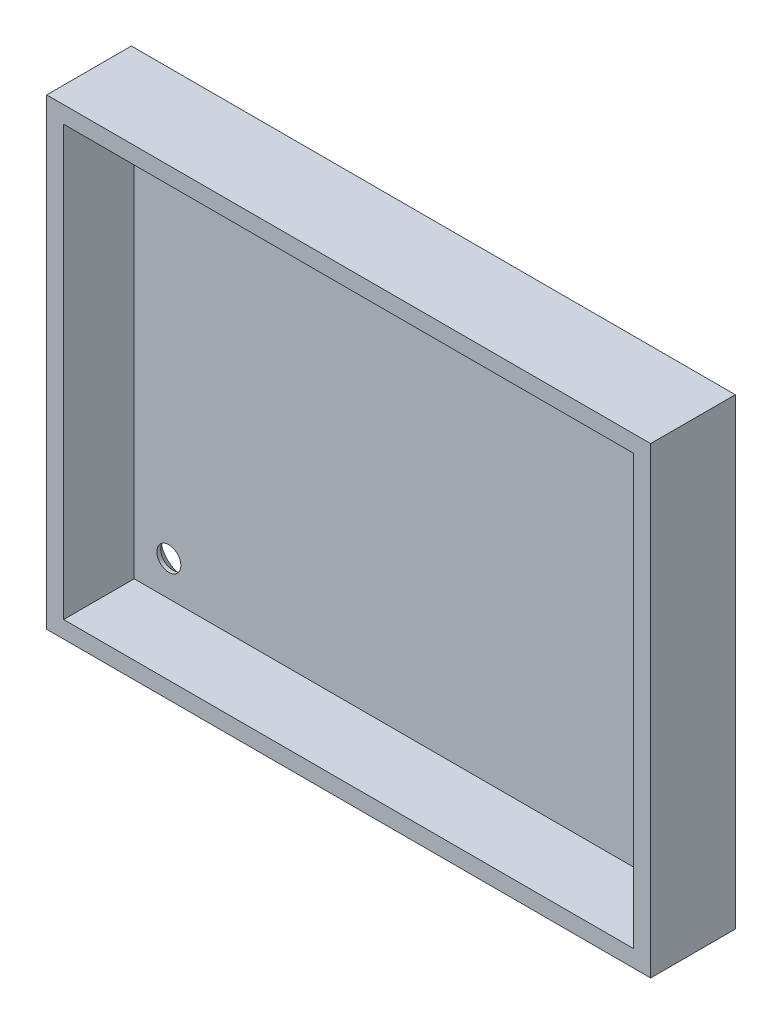
ISO-10303-21;
HEADER;
FILE_DESCRIPTION(('STEP AP214'),'2;1');
FILE_NAME('part.step','',(''),(''),'','','');
FILE_SCHEMA(('AUTOMOTIVE_DESIGN { 1 0 10303 214 1 1 1 1 }'));
ENDSEC;
DATA;
#1=APPLICATION_CONTEXT('core data for automotive mechanical design processes');
#2=APPLICATION_PROTOCOL_DEFINITION('international standard','automotive_design',2000,#1);
#3=PRODUCT_CONTEXT('',#1,'mechanical');
#4=PRODUCT('Part','Part','',(#3));
#5=PRODUCT_RELATED_PRODUCT_CATEGORY('part','',(#4));
#6=PRODUCT_DEFINITION_FORMATION('','',#4);
#7=PRODUCT_DEFINITION_CONTEXT('part definition',#1,'design');
#8=PRODUCT_DEFINITION('design','',#6,#7);
#9=PRODUCT_DEFINITION_SHAPE('','',#8);
#10=(LENGTH_UNIT() NAMED_UNIT(*) SI_UNIT(.MILLI.,.METRE.));
#11=(NAMED_UNIT(*) PLANE_ANGLE_UNIT() SI_UNIT($,.RADIAN.));
#12=(NAMED_UNIT(*) SI_UNIT($,.STERADIAN.) SOLID_ANGLE_UNIT());
#13=UNCERTAINTY_MEASURE_WITH_UNIT(LENGTH_MEASURE(1.E-05),#10,'distance_accuracy_value','');
#14=(GEOMETRIC_REPRESENTATION_CONTEXT(3) GLOBAL_UNCERTAINTY_ASSIGNED_CONTEXT((#13)) GLOBAL_UNIT_ASSIGNED_CONTEXT((#10,
#11,#12)) REPRESENTATION_CONTEXT('',''));
#15=CARTESIAN_POINT('',(0.,0.,0.));
#16=DIRECTION('',(0.,0.,1.));
#17=DIRECTION('',(1.,0.,0.));
#18=AXIS2_PLACEMENT_3D('',#15,#16,#17);
#19=CARTESIAN_POINT('',(0.,0.,-2.));
#20=DIRECTION('',(0.,0.,1.));
#21=DIRECTION('',(1.,0.,0.));
#22=AXIS2_PLACEMENT_3D('',#19,#20,#21);
#23=PLANE('',#22);
#24=DIRECTION('',(0.,1.,0.));
#25=VECTOR('',#24,1.);
#26=CARTESIAN_POINT('',(42.8,30.4,-2.));
#27=LINE('',#26,#25);
#28=CARTESIAN_POINT('',(42.8,-32.8,-2.));
#29=VERTEX_POINT('',#28);
#30=CARTESIAN_POINT('',(42.8,32.8,-2.));
#31=VERTEX_POINT('',#30);
#32=EDGE_CURVE('E120',#29,#31,#27,.T.);
#33=ORIENTED_EDGE('',*,*,#32,.F.);
#34=DIRECTION('',(1.,0.,0.));
#35=VECTOR('',#34,1.);
#36=CARTESIAN_POINT('',(-40.4,-32.8,-2.));
#37=LINE('',#36,#35);
#38=CARTESIAN_POINT('',(-42.8,-32.8,-2.));
#39=VERTEX_POINT('',#38);
#40=EDGE_CURVE('E154',#39,#29,#37,.T.);
#41=ORIENTED_EDGE('',*,*,#40,.F.);
#42=DIRECTION('',(0.,-1.,0.));
#43=VECTOR('',#42,1.);
#44=CARTESIAN_POINT('',(-42.8,30.4,-2.));
#45=LINE('',#44,#43);
#46=CARTESIAN_POINT('',(-42.8,32.8,-2.));
#47=VERTEX_POINT('',#46);
#48=EDGE_CURVE('E150',#47,#39,#45,.T.);
#49=ORIENTED_EDGE('',*,*,#48,.F.);
#50=DIRECTION('',(-1.,0.,0.));
#51=VECTOR('',#50,1.);
#52=CARTESIAN_POINT('',(-40.4,32.8,-2.));
#53=LINE('',#52,#51);
#54=EDGE_CURVE('E143',#31,#47,#53,.T.);
#55=ORIENTED_EDGE('',*,*,#54,.F.);
#56=EDGE_LOOP('',(#33,#41,#49,#55));
#57=FACE_BOUND('',#56,.T.);
#58=CARTESIAN_POINT('',(-35.4882310319587,25.4606514026197,-2.));
#59=DIRECTION('',(0.,0.,-1.));
#60=DIRECTION('',(-1.,0.,0.));
#61=AXIS2_PLACEMENT_3D('',#58,#59,#60);
#62=CIRCLE('',#61,3.15);
#63=CARTESIAN_POINT('',(-38.6382310319587,25.4606514026197,-2.));
#64=VERTEX_POINT('',#63);
#65=EDGE_CURVE('E184',#64,#64,#62,.T.);
#66=ORIENTED_EDGE('',*,*,#65,.F.);
#67=EDGE_LOOP('',(#66));
#68=FACE_BOUND('',#67,.T.);
#69=CARTESIAN_POINT('',(35.4882310319587,25.3987624345948,-2.));
#70=DIRECTION('',(0.,0.,-1.));
#71=DIRECTION('',(-1.,0.,0.));
#72=AXIS2_PLACEMENT_3D('',#69,#70,#71);
#73=CIRCLE('',#72,3.15);
#74=CARTESIAN_POINT('',(32.3382310319587,25.3987624345948,-2.));
#75=VERTEX_POINT('',#74);
#76=EDGE_CURVE('E188',#75,#75,#73,.T.);
#77=ORIENTED_EDGE('',*,*,#76,.F.);
#78=EDGE_LOOP('',(#77));
#79=FACE_BOUND('',#78,.T.);
#80=CARTESIAN_POINT('',(35.4882310319587,-25.4606514026197,-2.));
#81=DIRECTION('',(0.,0.,-1.));
#82=DIRECTION('',(-1.,0.,0.));
#83=AXIS2_PLACEMENT_3D('',#80,#81,#82);
#84=CIRCLE('',#83,3.15);
#85=CARTESIAN_POINT('',(32.3382310319587,-25.4606514026197,-2.));
#86=VERTEX_POINT('',#85);
#87=EDGE_CURVE('E192',#86,#86,#84,.T.);
#88=ORIENTED_EDGE('',*,*,#87,.F.);
#89=EDGE_LOOP('',(#88));
#90=FACE_BOUND('',#89,.T.);
#91=CARTESIAN_POINT('',(-35.4882310319587,-25.4606514026197,-2.));
#92=DIRECTION('',(0.,0.,-1.));
#93=DIRECTION('',(-1.,0.,0.));
#94=AXIS2_PLACEMENT_3D('',#91,#92,#93);
#95=CIRCLE('',#94,3.15);
#96=CARTESIAN_POINT('',(-38.6382310319587,-25.4606514026197,-2.));
#97=VERTEX_POINT('',#96);
#98=EDGE_CURVE('E195',#97,#97,#95,.T.);
#99=ORIENTED_EDGE('',*,*,#98,.F.);
#100=EDGE_LOOP('',(#99));
#101=FACE_BOUND('',#100,.T.);
#102=ADVANCED_FACE('F33',(#57,#68,#79,#90,#101),#23,.F.);
#103=CARTESIAN_POINT('',(42.8,30.4,10.));
#104=DIRECTION('',(-1.,0.,0.));
#105=DIRECTION('',(0.,-1.,0.));
#106=AXIS2_PLACEMENT_3D('',#103,#104,#105);
#107=PLANE('',#106);
#108=ORIENTED_EDGE('',*,*,#32,.T.);
#109=DIRECTION('',(0.,0.,-1.));
#110=VECTOR('',#109,1.);
#111=CARTESIAN_POINT('',(42.8,32.8,10.));
#112=LINE('',#111,#110);
#113=CARTESIAN_POINT('',(42.8,32.8,10.));
#114=VERTEX_POINT('',#113);
#115=EDGE_CURVE('E11',#114,#31,#112,.T.);
#116=ORIENTED_EDGE('',*,*,#115,.F.);
#117=DIRECTION('',(0.,1.,0.));
#118=VECTOR('',#117,1.);
#119=CARTESIAN_POINT('',(42.8,30.4,10.));
#120=LINE('',#119,#118);
#121=CARTESIAN_POINT('',(42.8,-32.8,10.));
#122=VERTEX_POINT('',#121);
#123=EDGE_CURVE('E158',#122,#114,#120,.T.);
#124=ORIENTED_EDGE('',*,*,#123,.F.);
#125=DIRECTION('',(0.,0.,-1.));
#126=VECTOR('',#125,1.);
#127=CARTESIAN_POINT('',(42.8,-32.8,10.));
#128=LINE('',#127,#126);
#129=EDGE_CURVE('E145',#122,#29,#128,.T.);
#130=ORIENTED_EDGE('',*,*,#129,.T.);
#131=EDGE_LOOP('',(#108,#116,#124,#130));
#132=FACE_BOUND('',#131,.T.);
#133=ADVANCED_FACE('F175',(#132),#107,.F.);
#134=CARTESIAN_POINT('',(-40.4,32.8,10.));
#135=DIRECTION('',(0.,-1.,0.));
#136=DIRECTION('',(0.,0.,-1.));
#137=AXIS2_PLACEMENT_3D('',#134,#135,#136);
#138=PLANE('',#137);
#139=ORIENTED_EDGE('',*,*,#54,.T.);
#140=DIRECTION('',(0.,0.,-1.));
#141=VECTOR('',#140,1.);
#142=CARTESIAN_POINT('',(-42.8,32.8,10.));
#143=LINE('',#142,#141);
#144=CARTESIAN_POINT('',(-42.8,32.8,10.));
#145=VERTEX_POINT('',#144);
#146=EDGE_CURVE('E41',#145,#47,#143,.T.);
#147=ORIENTED_EDGE('',*,*,#146,.F.);
#148=DIRECTION('',(-1.,0.,0.));
#149=VECTOR('',#148,1.);
#150=CARTESIAN_POINT('',(-40.4,32.8,10.));
#151=LINE('',#150,#149);
#152=EDGE_CURVE('E160',#114,#145,#151,.T.);
#153=ORIENTED_EDGE('',*,*,#152,.F.);
#154=ORIENTED_EDGE('',*,*,#115,.T.);
#155=EDGE_LOOP('',(#139,#147,#153,#154));
#156=FACE_BOUND('',#155,.T.);
#157=ADVANCED_FACE('F177',(#156),#138,.F.);
#158=CARTESIAN_POINT('',(-42.8,30.4,10.));
#159=DIRECTION('',(1.,0.,0.));
#160=DIRECTION('',(0.,1.,0.));
#161=AXIS2_PLACEMENT_3D('',#158,#159,#160);
#162=PLANE('',#161);
#163=ORIENTED_EDGE('',*,*,#48,.T.);
#164=DIRECTION('',(0.,0.,-1.));
#165=VECTOR('',#164,1.);
#166=CARTESIAN_POINT('',(-42.8,-32.8,10.));
#167=LINE('',#166,#165);
#168=CARTESIAN_POINT('',(-42.8,-32.8,10.));
#169=VERTEX_POINT('',#168);
#170=EDGE_CURVE('E148',#169,#39,#167,.T.);
#171=ORIENTED_EDGE('',*,*,#170,.F.);
#172=DIRECTION('',(0.,-1.,0.));
#173=VECTOR('',#172,1.);
#174=CARTESIAN_POINT('',(-42.8,30.4,10.));
#175=LINE('',#174,#173);
#176=EDGE_CURVE('E161',#145,#169,#175,.T.);
#177=ORIENTED_EDGE('',*,*,#176,.F.);
#178=ORIENTED_EDGE('',*,*,#146,.T.);
#179=EDGE_LOOP('',(#163,#171,#177,#178));
#180=FACE_BOUND('',#179,.T.);
#181=ADVANCED_FACE('F166',(#180),#162,.F.);
#182=CARTESIAN_POINT('',(-40.4,-32.8,10.));
#183=DIRECTION('',(0.,1.,0.));
#184=DIRECTION('',(0.,0.,1.));
#185=AXIS2_PLACEMENT_3D('',#182,#183,#184);
#186=PLANE('',#185);
#187=ORIENTED_EDGE('',*,*,#40,.T.);
#188=ORIENTED_EDGE('',*,*,#129,.F.);
#189=DIRECTION('',(1.,0.,0.));
#190=VECTOR('',#189,1.);
#191=CARTESIAN_POINT('',(-40.4,-32.8,10.));
#192=LINE('',#191,#190);
#193=EDGE_CURVE('E36',#169,#122,#192,.T.);
#194=ORIENTED_EDGE('',*,*,#193,.F.);
#195=ORIENTED_EDGE('',*,*,#170,.T.);
#196=EDGE_LOOP('',(#187,#188,#194,#195));
#197=FACE_BOUND('',#196,.T.);
#198=ADVANCED_FACE('F170',(#197),#186,.F.);
#199=CARTESIAN_POINT('',(0.,0.,10.));
#200=DIRECTION('',(0.,0.,1.));
#201=DIRECTION('',(1.,0.,0.));
#202=AXIS2_PLACEMENT_3D('',#199,#200,#201);
#203=PLANE('',#202);
#204=DIRECTION('',(0.,1.,0.));
#205=VECTOR('',#204,1.);
#206=CARTESIAN_POINT('',(40.4,30.4,10.));
#207=LINE('',#206,#205);
#208=CARTESIAN_POINT('',(40.4,-30.4,10.));
#209=VERTEX_POINT('',#208);
#210=CARTESIAN_POINT('',(40.4,30.4,10.));
#211=VERTEX_POINT('',#210);
#212=EDGE_CURVE('E101',#209,#211,#207,.T.);
#213=ORIENTED_EDGE('',*,*,#212,.F.);
#214=DIRECTION('',(1.,0.,0.));
#215=VECTOR('',#214,1.);
#216=CARTESIAN_POINT('',(-40.4,-30.4,10.));
#217=LINE('',#216,#215);
#218=CARTESIAN_POINT('',(-40.4,-30.4,10.));
#219=VERTEX_POINT('',#218);
#220=EDGE_CURVE('E127',#219,#209,#217,.T.);
#221=ORIENTED_EDGE('',*,*,#220,.F.);
#222=DIRECTION('',(0.,-1.,0.));
#223=VECTOR('',#222,1.);
#224=CARTESIAN_POINT('',(-40.4,30.4,10.));
#225=LINE('',#224,#223);
#226=CARTESIAN_POINT('',(-40.4,30.4,10.));
#227=VERTEX_POINT('',#226);
#228=EDGE_CURVE('E125',#227,#219,#225,.T.);
#229=ORIENTED_EDGE('',*,*,#228,.F.);
#230=DIRECTION('',(-1.,0.,0.));
#231=VECTOR('',#230,1.);
#232=CARTESIAN_POINT('',(-40.4,30.4,10.));
#233=LINE('',#232,#231);
#234=EDGE_CURVE('E112',#211,#227,#233,.T.);
#235=ORIENTED_EDGE('',*,*,#234,.F.);
#236=EDGE_LOOP('',(#213,#221,#229,#235));
#237=FACE_BOUND('',#236,.T.);
#238=ORIENTED_EDGE('',*,*,#123,.T.);
#239=ORIENTED_EDGE('',*,*,#152,.T.);
#240=ORIENTED_EDGE('',*,*,#176,.T.);
#241=ORIENTED_EDGE('',*,*,#193,.T.);
#242=EDGE_LOOP('',(#238,#239,#240,#241));
#243=FACE_BOUND('',#242,.T.);
#244=ADVANCED_FACE('F124',(#237,#243),#203,.T.);
#245=CARTESIAN_POINT('',(40.4,30.4,10.));
#246=DIRECTION('',(-1.,0.,0.));
#247=DIRECTION('',(0.,-1.,0.));
#248=AXIS2_PLACEMENT_3D('',#245,#246,#247);
#249=PLANE('',#248);
#250=DIRECTION('',(0.,1.,0.));
#251=VECTOR('',#250,1.);
#252=CARTESIAN_POINT('',(40.4,30.4,0.));
#253=LINE('',#252,#251);
#254=CARTESIAN_POINT('',(40.4,-30.4,0.));
#255=VERTEX_POINT('',#254);
#256=CARTESIAN_POINT('',(40.4,30.4,0.));
#257=VERTEX_POINT('',#256);
#258=EDGE_CURVE('E132',#255,#257,#253,.T.);
#259=ORIENTED_EDGE('',*,*,#258,.F.);
#260=DIRECTION('',(0.,0.,-1.));
#261=VECTOR('',#260,1.);
#262=CARTESIAN_POINT('',(40.4,-30.4,10.));
#263=LINE('',#262,#261);
#264=EDGE_CURVE('E108',#209,#255,#263,.T.);
#265=ORIENTED_EDGE('',*,*,#264,.F.);
#266=ORIENTED_EDGE('',*,*,#212,.T.);
#267=DIRECTION('',(0.,0.,-1.));
#268=VECTOR('',#267,1.);
#269=CARTESIAN_POINT('',(40.4,30.4,10.));
#270=LINE('',#269,#268);
#271=EDGE_CURVE('E105',#211,#257,#270,.T.);
#272=ORIENTED_EDGE('',*,*,#271,.T.);
#273=EDGE_LOOP('',(#259,#265,#266,#272));
#274=FACE_BOUND('',#273,.T.);
#275=ADVANCED_FACE('F104',(#274),#249,.T.);
#276=CARTESIAN_POINT('',(-40.4,30.4,10.));
#277=DIRECTION('',(0.,-1.,0.));
#278=DIRECTION('',(0.,0.,-1.));
#279=AXIS2_PLACEMENT_3D('',#276,#277,#278);
#280=PLANE('',#279);
#281=DIRECTION('',(-1.,0.,0.));
#282=VECTOR('',#281,1.);
#283=CARTESIAN_POINT('',(-40.4,30.4,0.));
#284=LINE('',#283,#282);
#285=CARTESIAN_POINT('',(-40.4,30.4,0.));
#286=VERTEX_POINT('',#285);
#287=EDGE_CURVE('E119',#257,#286,#284,.T.);
#288=ORIENTED_EDGE('',*,*,#287,.F.);
#289=ORIENTED_EDGE('',*,*,#271,.F.);
#290=ORIENTED_EDGE('',*,*,#234,.T.);
#291=DIRECTION('',(0.,0.,-1.));
#292=VECTOR('',#291,1.);
#293=CARTESIAN_POINT('',(-40.4,30.4,10.));
#294=LINE('',#293,#292);
#295=EDGE_CURVE('E121',#227,#286,#294,.T.);
#296=ORIENTED_EDGE('',*,*,#295,.T.);
#297=EDGE_LOOP('',(#288,#289,#290,#296));
#298=FACE_BOUND('',#297,.T.);
#299=ADVANCED_FACE('F116',(#298),#280,.T.);
#300=CARTESIAN_POINT('',(-40.4,30.4,10.));
#301=DIRECTION('',(1.,0.,0.));
#302=DIRECTION('',(0.,1.,0.));
#303=AXIS2_PLACEMENT_3D('',#300,#301,#302);
#304=PLANE('',#303);
#305=DIRECTION('',(0.,-1.,0.));
#306=VECTOR('',#305,1.);
#307=CARTESIAN_POINT('',(-40.4,30.4,0.));
#308=LINE('',#307,#306);
#309=CARTESIAN_POINT('',(-40.4,-30.4,0.));
#310=VERTEX_POINT('',#309);
#311=EDGE_CURVE('E136',#286,#310,#308,.T.);
#312=ORIENTED_EDGE('',*,*,#311,.F.);
#313=ORIENTED_EDGE('',*,*,#295,.F.);
#314=ORIENTED_EDGE('',*,*,#228,.T.);
#315=DIRECTION('',(0.,0.,-1.));
#316=VECTOR('',#315,1.);
#317=CARTESIAN_POINT('',(-40.4,-30.4,10.));
#318=LINE('',#317,#316);
#319=EDGE_CURVE('E49',#219,#310,#318,.T.);
#320=ORIENTED_EDGE('',*,*,#319,.T.);
#321=EDGE_LOOP('',(#312,#313,#314,#320));
#322=FACE_BOUND('',#321,.T.);
#323=ADVANCED_FACE('F235',(#322),#304,.T.);
#324=CARTESIAN_POINT('',(-40.4,-30.4,10.));
#325=DIRECTION('',(0.,1.,0.));
#326=DIRECTION('',(0.,0.,1.));
#327=AXIS2_PLACEMENT_3D('',#324,#325,#326);
#328=PLANE('',#327);
#329=DIRECTION('',(1.,0.,0.));
#330=VECTOR('',#329,1.);
#331=CARTESIAN_POINT('',(-40.4,-30.4,0.));
#332=LINE('',#331,#330);
#333=EDGE_CURVE('E113',#310,#255,#332,.T.);
#334=ORIENTED_EDGE('',*,*,#333,.F.);
#335=ORIENTED_EDGE('',*,*,#319,.F.);
#336=ORIENTED_EDGE('',*,*,#220,.T.);
#337=ORIENTED_EDGE('',*,*,#264,.T.);
#338=EDGE_LOOP('',(#334,#335,#336,#337));
#339=FACE_BOUND('',#338,.T.);
#340=ADVANCED_FACE('F230',(#339),#328,.T.);
#341=CARTESIAN_POINT('',(0.,0.,0.));
#342=DIRECTION('',(0.,0.,1.));
#343=DIRECTION('',(1.,0.,0.));
#344=AXIS2_PLACEMENT_3D('',#341,#342,#343);
#345=PLANE('',#344);
#346=CARTESIAN_POINT('',(-35.4882310319587,-25.4606514026197,0.));
#347=DIRECTION('',(0.,0.,1.));
#348=DIRECTION('',(1.,0.,0.));
#349=AXIS2_PLACEMENT_3D('',#346,#347,#348);
#350=CIRCLE('',#349,1.7);
#351=CARTESIAN_POINT('',(-33.7882310319587,-25.4606514026197,0.));
#352=VERTEX_POINT('',#351);
#353=EDGE_CURVE('E200',#352,#352,#350,.T.);
#354=ORIENTED_EDGE('',*,*,#353,.F.);
#355=EDGE_LOOP('',(#354));
#356=FACE_BOUND('',#355,.T.);
#357=CARTESIAN_POINT('',(35.4882310319587,-25.4606514026197,0.));
#358=DIRECTION('',(0.,0.,1.));
#359=DIRECTION('',(1.,0.,0.));
#360=AXIS2_PLACEMENT_3D('',#357,#358,#359);
#361=CIRCLE('',#360,1.7);
#362=CARTESIAN_POINT('',(37.1882310319587,-25.4606514026197,0.));
#363=VERTEX_POINT('',#362);
#364=EDGE_CURVE('E209',#363,#363,#361,.T.);
#365=ORIENTED_EDGE('',*,*,#364,.F.);
#366=EDGE_LOOP('',(#365));
#367=FACE_BOUND('',#366,.T.);
#368=CARTESIAN_POINT('',(35.4882310319587,25.3987624345948,0.));
#369=DIRECTION('',(0.,0.,1.));
#370=DIRECTION('',(1.,0.,0.));
#371=AXIS2_PLACEMENT_3D('',#368,#369,#370);
#372=CIRCLE('',#371,1.7);
#373=CARTESIAN_POINT('',(37.1882310319587,25.3987624345948,0.));
#374=VERTEX_POINT('',#373);
#375=EDGE_CURVE('E216',#374,#374,#372,.T.);
#376=ORIENTED_EDGE('',*,*,#375,.F.);
#377=EDGE_LOOP('',(#376));
#378=FACE_BOUND('',#377,.T.);
#379=CARTESIAN_POINT('',(-35.4882310319587,25.4606514026197,0.));
#380=DIRECTION('',(0.,0.,1.));
#381=DIRECTION('',(1.,0.,0.));
#382=AXIS2_PLACEMENT_3D('',#379,#380,#381);
#383=CIRCLE('',#382,1.7);
#384=CARTESIAN_POINT('',(-33.7882310319587,25.4606514026197,0.));
#385=VERTEX_POINT('',#384);
#386=EDGE_CURVE('E134',#385,#385,#383,.T.);
#387=ORIENTED_EDGE('',*,*,#386,.F.);
#388=EDGE_LOOP('',(#387));
#389=FACE_BOUND('',#388,.T.);
#390=ORIENTED_EDGE('',*,*,#258,.T.);
#391=ORIENTED_EDGE('',*,*,#287,.T.);
#392=ORIENTED_EDGE('',*,*,#311,.T.);
#393=ORIENTED_EDGE('',*,*,#333,.T.);
#394=EDGE_LOOP('',(#390,#391,#392,#393));
#395=FACE_BOUND('',#394,.T.);
#396=ADVANCED_FACE('F227',(#356,#367,#378,#389,#395),#345,.T.);
#397=CARTESIAN_POINT('',(-35.4882310319587,25.4606514026197,-2.));
#398=DIRECTION('',(0.,0.,-1.));
#399=DIRECTION('',(-1.,0.,0.));
#400=AXIS2_PLACEMENT_3D('',#397,#398,#399);
#401=CYLINDRICAL_SURFACE('',#400,1.7);
#402=CARTESIAN_POINT('',(-35.4882310319587,25.4606514026197,-0.549999999999998));
#403=DIRECTION('',(0.,0.,-1.));
#404=DIRECTION('',(-1.,0.,0.));
#405=AXIS2_PLACEMENT_3D('',#402,#403,#404);
#406=CIRCLE('',#405,1.7);
#407=CARTESIAN_POINT('',(-37.1882310319587,25.4606514026197,-0.549999999999998));
#408=VERTEX_POINT('',#407);
#409=EDGE_CURVE('E220',#408,#408,#406,.T.);
#410=ORIENTED_EDGE('',*,*,#409,.T.);
#411=EDGE_LOOP('',(#410));
#412=FACE_BOUND('',#411,.T.);
#413=ORIENTED_EDGE('',*,*,#386,.T.);
#414=EDGE_LOOP('',(#413));
#415=FACE_BOUND('',#414,.T.);
#416=ADVANCED_FACE('F225',(#412,#415),#401,.F.);
#417=CARTESIAN_POINT('',(-35.4882310319587,25.4606514026197,-2.));
#418=DIRECTION('',(0.,0.,-1.));
#419=DIRECTION('',(-1.,0.,0.));
#420=AXIS2_PLACEMENT_3D('',#417,#418,#419);
#421=CONICAL_SURFACE('',#420,3.15,0.785398163397447);
#422=ORIENTED_EDGE('',*,*,#409,.F.);
#423=EDGE_LOOP('',(#422));
#424=FACE_BOUND('',#423,.T.);
#425=ORIENTED_EDGE('',*,*,#65,.T.);
#426=EDGE_LOOP('',(#425));
#427=FACE_BOUND('',#426,.T.);
#428=ADVANCED_FACE('F302',(#424,#427),#421,.F.);
#429=CARTESIAN_POINT('',(35.4882310319587,25.3987624345948,-2.));
#430=DIRECTION('',(0.,0.,-1.));
#431=DIRECTION('',(-1.,0.,0.));
#432=AXIS2_PLACEMENT_3D('',#429,#430,#431);
#433=CYLINDRICAL_SURFACE('',#432,1.7);
#434=CARTESIAN_POINT('',(35.4882310319587,25.3987624345948,-0.549999999999998));
#435=DIRECTION('',(0.,0.,-1.));
#436=DIRECTION('',(-1.,0.,0.));
#437=AXIS2_PLACEMENT_3D('',#434,#435,#436);
#438=CIRCLE('',#437,1.7);
#439=CARTESIAN_POINT('',(33.7882310319587,25.3987624345948,-0.549999999999998));
#440=VERTEX_POINT('',#439);
#441=EDGE_CURVE('E213',#440,#440,#438,.T.);
#442=ORIENTED_EDGE('',*,*,#441,.T.);
#443=EDGE_LOOP('',(#442));
#444=FACE_BOUND('',#443,.T.);
#445=ORIENTED_EDGE('',*,*,#375,.T.);
#446=EDGE_LOOP('',(#445));
#447=FACE_BOUND('',#446,.T.);
#448=ADVANCED_FACE('F311',(#444,#447),#433,.F.);
#449=CARTESIAN_POINT('',(35.4882310319587,25.3987624345948,-2.));
#450=DIRECTION('',(0.,0.,-1.));
#451=DIRECTION('',(-1.,0.,0.));
#452=AXIS2_PLACEMENT_3D('',#449,#450,#451);
#453=CONICAL_SURFACE('',#452,3.15,0.785398163397447);
#454=ORIENTED_EDGE('',*,*,#441,.F.);
#455=EDGE_LOOP('',(#454));
#456=FACE_BOUND('',#455,.T.);
#457=ORIENTED_EDGE('',*,*,#76,.T.);
#458=EDGE_LOOP('',(#457));
#459=FACE_BOUND('',#458,.T.);
#460=ADVANCED_FACE('F321',(#456,#459),#453,.F.);
#461=CARTESIAN_POINT('',(35.4882310319587,-25.4606514026197,-2.));
#462=DIRECTION('',(0.,0.,-1.));
#463=DIRECTION('',(-1.,0.,0.));
#464=AXIS2_PLACEMENT_3D('',#461,#462,#463);
#465=CYLINDRICAL_SURFACE('',#464,1.7);
#466=CARTESIAN_POINT('',(35.4882310319587,-25.4606514026197,-0.549999999999998));
#467=DIRECTION('',(0.,0.,-1.));
#468=DIRECTION('',(-1.,0.,0.));
#469=AXIS2_PLACEMENT_3D('',#466,#467,#468);
#470=CIRCLE('',#469,1.7);
#471=CARTESIAN_POINT('',(33.7882310319587,-25.4606514026197,-0.549999999999998));
#472=VERTEX_POINT('',#471);
#473=EDGE_CURVE('E206',#472,#472,#470,.T.);
#474=ORIENTED_EDGE('',*,*,#473,.T.);
#475=EDGE_LOOP('',(#474));
#476=FACE_BOUND('',#475,.T.);
#477=ORIENTED_EDGE('',*,*,#364,.T.);
#478=EDGE_LOOP('',(#477));
#479=FACE_BOUND('',#478,.T.);
#480=ADVANCED_FACE('F331',(#476,#479),#465,.F.);
#481=CARTESIAN_POINT('',(35.4882310319587,-25.4606514026197,-2.));
#482=DIRECTION('',(0.,0.,-1.));
#483=DIRECTION('',(-1.,0.,0.));
#484=AXIS2_PLACEMENT_3D('',#481,#482,#483);
#485=CONICAL_SURFACE('',#484,3.15,0.785398163397447);
#486=ORIENTED_EDGE('',*,*,#473,.F.);
#487=EDGE_LOOP('',(#486));
#488=FACE_BOUND('',#487,.T.);
#489=ORIENTED_EDGE('',*,*,#87,.T.);
#490=EDGE_LOOP('',(#489));
#491=FACE_BOUND('',#490,.T.);
#492=ADVANCED_FACE('F341',(#488,#491),#485,.F.);
#493=CARTESIAN_POINT('',(-35.4882310319587,-25.4606514026197,-2.));
#494=DIRECTION('',(0.,0.,-1.));
#495=DIRECTION('',(-1.,0.,0.));
#496=AXIS2_PLACEMENT_3D('',#493,#494,#495);
#497=CYLINDRICAL_SURFACE('',#496,1.7);
#498=CARTESIAN_POINT('',(-35.4882310319587,-25.4606514026197,-0.549999999999998));
#499=DIRECTION('',(0.,0.,-1.));
#500=DIRECTION('',(-1.,0.,0.));
#501=AXIS2_PLACEMENT_3D('',#498,#499,#500);
#502=CIRCLE('',#501,1.7);
#503=CARTESIAN_POINT('',(-37.1882310319587,-25.4606514026197,-0.549999999999998));
#504=VERTEX_POINT('',#503);
#505=EDGE_CURVE('E197',#504,#504,#502,.T.);
#506=ORIENTED_EDGE('',*,*,#505,.T.);
#507=EDGE_LOOP('',(#506));
#508=FACE_BOUND('',#507,.T.);
#509=ORIENTED_EDGE('',*,*,#353,.T.);
#510=EDGE_LOOP('',(#509));
#511=FACE_BOUND('',#510,.T.);
#512=ADVANCED_FACE('F351',(#508,#511),#497,.F.);
#513=CARTESIAN_POINT('',(-35.4882310319587,-25.4606514026197,-2.));
#514=DIRECTION('',(0.,0.,-1.));
#515=DIRECTION('',(-1.,0.,0.));
#516=AXIS2_PLACEMENT_3D('',#513,#514,#515);
#517=CONICAL_SURFACE('',#516,3.15,0.785398163397447);
#518=ORIENTED_EDGE('',*,*,#505,.F.);
#519=EDGE_LOOP('',(#518));
#520=FACE_BOUND('',#519,.T.);
#521=ORIENTED_EDGE('',*,*,#98,.T.);
#522=EDGE_LOOP('',(#521));
#523=FACE_BOUND('',#522,.T.);
#524=ADVANCED_FACE('F361',(#520,#523),#517,.F.);
#525=CLOSED_SHELL('',(#102,#133,#157,#181,#198,#244,#275,#299,#323,#340,#396,#416,#428,#448,
#460,#480,#492,#512,#524));
#526=MANIFOLD_SOLID_BREP('B2',#525);
#527=ADVANCED_BREP_SHAPE_REPRESENTATION('',(#18,#526),#14);
#528=SHAPE_DEFINITION_REPRESENTATION(#9,#527);
ENDSEC;
END-ISO-10303-21;
